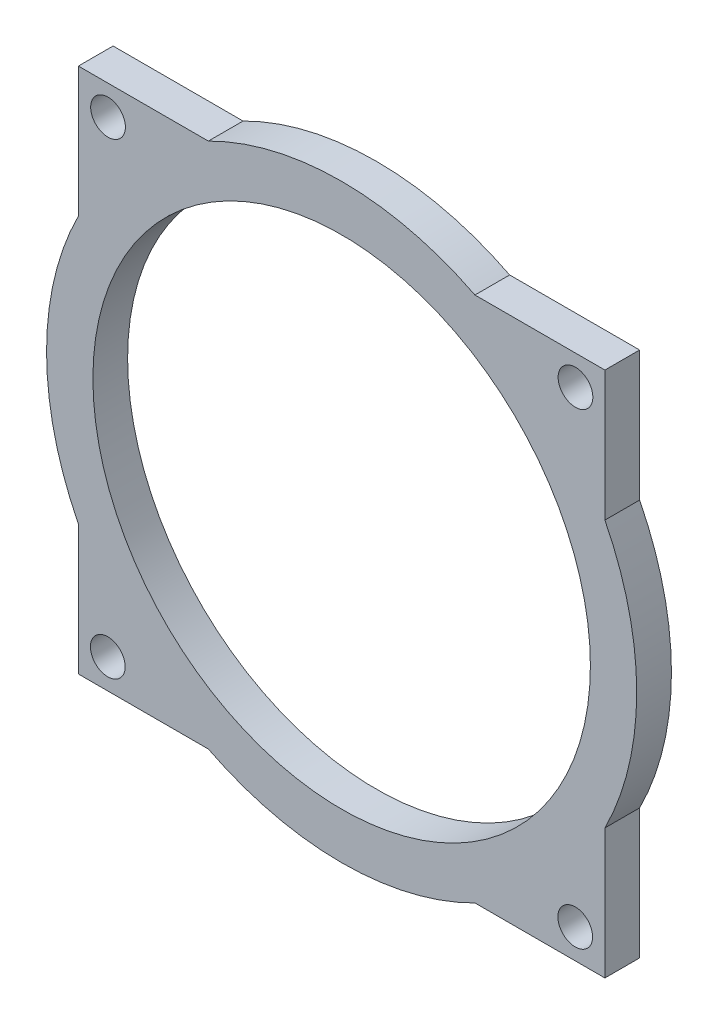
ISO-10303-21;
HEADER;
FILE_DESCRIPTION(('STEP AP214'),'2;1');
FILE_NAME('part.step','',(''),(''),'','','');
FILE_SCHEMA(('AUTOMOTIVE_DESIGN { 1 0 10303 214 1 1 1 1 }'));
ENDSEC;
DATA;
#1=APPLICATION_CONTEXT('core data for automotive mechanical design processes');
#2=APPLICATION_PROTOCOL_DEFINITION('international standard','automotive_design',2000,#1);
#3=PRODUCT_CONTEXT('',#1,'mechanical');
#4=PRODUCT('Part','Part','',(#3));
#5=PRODUCT_RELATED_PRODUCT_CATEGORY('part','',(#4));
#6=PRODUCT_DEFINITION_FORMATION('','',#4);
#7=PRODUCT_DEFINITION_CONTEXT('part definition',#1,'design');
#8=PRODUCT_DEFINITION('design','',#6,#7);
#9=PRODUCT_DEFINITION_SHAPE('','',#8);
#10=(LENGTH_UNIT() NAMED_UNIT(*) SI_UNIT(.MILLI.,.METRE.));
#11=(NAMED_UNIT(*) PLANE_ANGLE_UNIT() SI_UNIT($,.RADIAN.));
#12=(NAMED_UNIT(*) SI_UNIT($,.STERADIAN.) SOLID_ANGLE_UNIT());
#13=UNCERTAINTY_MEASURE_WITH_UNIT(LENGTH_MEASURE(1.E-05),#10,'distance_accuracy_value','');
#14=(GEOMETRIC_REPRESENTATION_CONTEXT(3) GLOBAL_UNCERTAINTY_ASSIGNED_CONTEXT((#13)) GLOBAL_UNIT_ASSIGNED_CONTEXT((#10,
#11,#12)) REPRESENTATION_CONTEXT('',''));
#15=CARTESIAN_POINT('',(0.,0.,0.));
#16=DIRECTION('',(0.,0.,1.));
#17=DIRECTION('',(1.,0.,0.));
#18=AXIS2_PLACEMENT_3D('',#15,#16,#17);
#19=CARTESIAN_POINT('',(22.75,0.,3.));
#20=DIRECTION('',(-1.,0.,0.));
#21=DIRECTION('',(0.,0.,1.));
#22=AXIS2_PLACEMENT_3D('',#19,#20,#21);
#23=PLANE('',#22);
#24=DIRECTION('',(0.,1.,0.));
#25=VECTOR('',#24,1.);
#26=CARTESIAN_POINT('',(22.75,0.,0.));
#27=LINE('',#26,#25);
#28=CARTESIAN_POINT('',(22.75,-22.7499999999994,0.));
#29=VERTEX_POINT('',#28);
#30=CARTESIAN_POINT('',(22.75,-11.5190060335083,0.));
#31=VERTEX_POINT('',#30);
#32=EDGE_CURVE('E227',#29,#31,#27,.T.);
#33=ORIENTED_EDGE('',*,*,#32,.T.);
#34=DIRECTION('',(0.,0.,-1.));
#35=VECTOR('',#34,1.);
#36=CARTESIAN_POINT('',(22.75,-11.5190060335083,3.));
#37=LINE('',#36,#35);
#38=CARTESIAN_POINT('',(22.75,-11.5190060335083,3.));
#39=VERTEX_POINT('',#38);
#40=EDGE_CURVE('E11',#39,#31,#37,.T.);
#41=ORIENTED_EDGE('',*,*,#40,.F.);
#42=DIRECTION('',(0.,1.,0.));
#43=VECTOR('',#42,1.);
#44=CARTESIAN_POINT('',(22.75,0.,3.));
#45=LINE('',#44,#43);
#46=CARTESIAN_POINT('',(22.75,-22.7499999999994,3.));
#47=VERTEX_POINT('',#46);
#48=EDGE_CURVE('E174',#47,#39,#45,.T.);
#49=ORIENTED_EDGE('',*,*,#48,.F.);
#50=DIRECTION('',(0.,0.,-1.));
#51=VECTOR('',#50,1.);
#52=CARTESIAN_POINT('',(22.75,-22.7499999999994,3.));
#53=LINE('',#52,#51);
#54=EDGE_CURVE('E49',#47,#29,#53,.T.);
#55=ORIENTED_EDGE('',*,*,#54,.T.);
#56=EDGE_LOOP('',(#33,#41,#49,#55));
#57=FACE_BOUND('',#56,.T.);
#58=ADVANCED_FACE('F32',(#57),#23,.F.);
#59=CARTESIAN_POINT('',(0.,0.,3.));
#60=DIRECTION('',(0.,0.,-1.));
#61=DIRECTION('',(-1.,0.,0.));
#62=AXIS2_PLACEMENT_3D('',#59,#60,#61);
#63=CYLINDRICAL_SURFACE('',#62,25.5);
#64=CARTESIAN_POINT('',(0.,0.,0.));
#65=DIRECTION('',(0.,0.,1.));
#66=DIRECTION('',(1.,0.,0.));
#67=AXIS2_PLACEMENT_3D('',#64,#65,#66);
#68=CIRCLE('',#67,25.5);
#69=CARTESIAN_POINT('',(22.75,11.5190060335083,0.));
#70=VERTEX_POINT('',#69);
#71=EDGE_CURVE('E223',#31,#70,#68,.T.);
#72=ORIENTED_EDGE('',*,*,#71,.T.);
#73=DIRECTION('',(0.,0.,-1.));
#74=VECTOR('',#73,1.);
#75=CARTESIAN_POINT('',(22.75,11.5190060335083,3.));
#76=LINE('',#75,#74);
#77=CARTESIAN_POINT('',(22.75,11.5190060335083,3.));
#78=VERTEX_POINT('',#77);
#79=EDGE_CURVE('E41',#78,#70,#76,.T.);
#80=ORIENTED_EDGE('',*,*,#79,.F.);
#81=CARTESIAN_POINT('',(0.,0.,3.));
#82=DIRECTION('',(0.,0.,1.));
#83=DIRECTION('',(1.,0.,0.));
#84=AXIS2_PLACEMENT_3D('',#81,#82,#83);
#85=CIRCLE('',#84,25.5);
#86=EDGE_CURVE('E100',#39,#78,#85,.T.);
#87=ORIENTED_EDGE('',*,*,#86,.F.);
#88=ORIENTED_EDGE('',*,*,#40,.T.);
#89=EDGE_LOOP('',(#72,#80,#87,#88));
#90=FACE_BOUND('',#89,.T.);
#91=ADVANCED_FACE('F224',(#90),#63,.T.);
#92=CARTESIAN_POINT('',(22.750000000001,1.87644016289042E-12,3.));
#93=DIRECTION('',(1.,0.,0.));
#94=DIRECTION('',(0.,1.,0.));
#95=AXIS2_PLACEMENT_3D('',#92,#93,#94);
#96=PLANE('',#95);
#97=DIRECTION('',(0.,-1.,0.));
#98=VECTOR('',#97,1.);
#99=CARTESIAN_POINT('',(22.750000000001,1.87644016289042E-12,0.));
#100=LINE('',#99,#98);
#101=CARTESIAN_POINT('',(22.7499999999991,22.75,0.));
#102=VERTEX_POINT('',#101);
#103=EDGE_CURVE('E221',#102,#70,#100,.T.);
#104=ORIENTED_EDGE('',*,*,#103,.F.);
#105=DIRECTION('',(0.,0.,-1.));
#106=VECTOR('',#105,1.);
#107=CARTESIAN_POINT('',(22.7499999999991,22.75,3.));
#108=LINE('',#107,#106);
#109=CARTESIAN_POINT('',(22.7499999999991,22.75,3.));
#110=VERTEX_POINT('',#109);
#111=EDGE_CURVE('E215',#110,#102,#108,.T.);
#112=ORIENTED_EDGE('',*,*,#111,.F.);
#113=DIRECTION('',(0.,-1.,0.));
#114=VECTOR('',#113,1.);
#115=CARTESIAN_POINT('',(22.750000000001,1.87644016289042E-12,3.));
#116=LINE('',#115,#114);
#117=EDGE_CURVE('E170',#110,#78,#116,.T.);
#118=ORIENTED_EDGE('',*,*,#117,.T.);
#119=ORIENTED_EDGE('',*,*,#79,.T.);
#120=EDGE_LOOP('',(#104,#112,#118,#119));
#121=FACE_BOUND('',#120,.T.);
#122=ADVANCED_FACE('F219',(#121),#96,.T.);
#123=CARTESIAN_POINT('',(0.,22.75,3.));
#124=DIRECTION('',(0.,-1.,0.));
#125=DIRECTION('',(0.,0.,-1.));
#126=AXIS2_PLACEMENT_3D('',#123,#124,#125);
#127=PLANE('',#126);
#128=DIRECTION('',(-1.,0.,0.));
#129=VECTOR('',#128,1.);
#130=CARTESIAN_POINT('',(0.,22.75,0.));
#131=LINE('',#130,#129);
#132=CARTESIAN_POINT('',(11.5190060335083,22.75,0.));
#133=VERTEX_POINT('',#132);
#134=EDGE_CURVE('E232',#102,#133,#131,.T.);
#135=ORIENTED_EDGE('',*,*,#134,.T.);
#136=DIRECTION('',(0.,0.,-1.));
#137=VECTOR('',#136,1.);
#138=CARTESIAN_POINT('',(11.5190060335083,22.75,3.));
#139=LINE('',#138,#137);
#140=CARTESIAN_POINT('',(11.5190060335083,22.75,3.));
#141=VERTEX_POINT('',#140);
#142=EDGE_CURVE('E212',#141,#133,#139,.T.);
#143=ORIENTED_EDGE('',*,*,#142,.F.);
#144=DIRECTION('',(-1.,0.,0.));
#145=VECTOR('',#144,1.);
#146=CARTESIAN_POINT('',(0.,22.75,3.));
#147=LINE('',#146,#145);
#148=EDGE_CURVE('E168',#110,#141,#147,.T.);
#149=ORIENTED_EDGE('',*,*,#148,.F.);
#150=ORIENTED_EDGE('',*,*,#111,.T.);
#151=EDGE_LOOP('',(#135,#143,#149,#150));
#152=FACE_BOUND('',#151,.T.);
#153=ADVANCED_FACE('F303',(#152),#127,.F.);
#154=CARTESIAN_POINT('',(0.,0.,3.));
#155=DIRECTION('',(0.,0.,-1.));
#156=DIRECTION('',(-1.,0.,0.));
#157=AXIS2_PLACEMENT_3D('',#154,#155,#156);
#158=CYLINDRICAL_SURFACE('',#157,25.5);
#159=CARTESIAN_POINT('',(0.,0.,0.));
#160=DIRECTION('',(0.,0.,1.));
#161=DIRECTION('',(1.,0.,0.));
#162=AXIS2_PLACEMENT_3D('',#159,#160,#161);
#163=CIRCLE('',#162,25.5);
#164=CARTESIAN_POINT('',(-11.5190060335082,22.75,0.));
#165=VERTEX_POINT('',#164);
#166=EDGE_CURVE('E234',#133,#165,#163,.T.);
#167=ORIENTED_EDGE('',*,*,#166,.T.);
#168=DIRECTION('',(0.,0.,-1.));
#169=VECTOR('',#168,1.);
#170=CARTESIAN_POINT('',(-11.5190060335082,22.75,3.));
#171=LINE('',#170,#169);
#172=CARTESIAN_POINT('',(-11.5190060335082,22.75,3.));
#173=VERTEX_POINT('',#172);
#174=EDGE_CURVE('E210',#173,#165,#171,.T.);
#175=ORIENTED_EDGE('',*,*,#174,.F.);
#176=CARTESIAN_POINT('',(0.,0.,3.));
#177=DIRECTION('',(0.,0.,1.));
#178=DIRECTION('',(1.,0.,0.));
#179=AXIS2_PLACEMENT_3D('',#176,#177,#178);
#180=CIRCLE('',#179,25.5);
#181=EDGE_CURVE('E164',#141,#173,#180,.T.);
#182=ORIENTED_EDGE('',*,*,#181,.F.);
#183=ORIENTED_EDGE('',*,*,#142,.T.);
#184=EDGE_LOOP('',(#167,#175,#182,#183));
#185=FACE_BOUND('',#184,.T.);
#186=ADVANCED_FACE('F305',(#185),#158,.T.);
#187=CARTESIAN_POINT('',(0.,22.75,3.));
#188=DIRECTION('',(0.,1.,0.));
#189=DIRECTION('',(0.,0.,1.));
#190=AXIS2_PLACEMENT_3D('',#187,#188,#189);
#191=PLANE('',#190);
#192=DIRECTION('',(1.,0.,0.));
#193=VECTOR('',#192,1.);
#194=CARTESIAN_POINT('',(0.,22.75,0.));
#195=LINE('',#194,#193);
#196=CARTESIAN_POINT('',(-22.7500000000002,22.75,0.));
#197=VERTEX_POINT('',#196);
#198=EDGE_CURVE('E240',#197,#165,#195,.T.);
#199=ORIENTED_EDGE('',*,*,#198,.F.);
#200=DIRECTION('',(0.,0.,-1.));
#201=VECTOR('',#200,1.);
#202=CARTESIAN_POINT('',(-22.7500000000002,22.75,3.));
#203=LINE('',#202,#201);
#204=CARTESIAN_POINT('',(-22.7500000000002,22.75,3.));
#205=VERTEX_POINT('',#204);
#206=EDGE_CURVE('E208',#205,#197,#203,.T.);
#207=ORIENTED_EDGE('',*,*,#206,.F.);
#208=DIRECTION('',(1.,0.,0.));
#209=VECTOR('',#208,1.);
#210=CARTESIAN_POINT('',(0.,22.75,3.));
#211=LINE('',#210,#209);
#212=EDGE_CURVE('E159',#205,#173,#211,.T.);
#213=ORIENTED_EDGE('',*,*,#212,.T.);
#214=ORIENTED_EDGE('',*,*,#174,.T.);
#215=EDGE_LOOP('',(#199,#207,#213,#214));
#216=FACE_BOUND('',#215,.T.);
#217=ADVANCED_FACE('F308',(#216),#191,.T.);
#218=CARTESIAN_POINT('',(-22.7500000000002,0.,3.));
#219=DIRECTION('',(1.,0.,0.));
#220=DIRECTION('',(0.,0.,-1.));
#221=AXIS2_PLACEMENT_3D('',#218,#219,#220);
#222=PLANE('',#221);
#223=DIRECTION('',(0.,-1.,0.));
#224=VECTOR('',#223,1.);
#225=CARTESIAN_POINT('',(-22.7500000000002,0.,0.));
#226=LINE('',#225,#224);
#227=CARTESIAN_POINT('',(-22.7500000000002,11.5190060335083,0.));
#228=VERTEX_POINT('',#227);
#229=EDGE_CURVE('E243',#197,#228,#226,.T.);
#230=ORIENTED_EDGE('',*,*,#229,.T.);
#231=DIRECTION('',(0.,0.,-1.));
#232=VECTOR('',#231,1.);
#233=CARTESIAN_POINT('',(-22.7500000000002,11.5190060335083,3.));
#234=LINE('',#233,#232);
#235=CARTESIAN_POINT('',(-22.7500000000002,11.5190060335083,3.));
#236=VERTEX_POINT('',#235);
#237=EDGE_CURVE('E205',#236,#228,#234,.T.);
#238=ORIENTED_EDGE('',*,*,#237,.F.);
#239=DIRECTION('',(0.,-1.,0.));
#240=VECTOR('',#239,1.);
#241=CARTESIAN_POINT('',(-22.7500000000002,0.,3.));
#242=LINE('',#241,#240);
#243=EDGE_CURVE('E156',#205,#236,#242,.T.);
#244=ORIENTED_EDGE('',*,*,#243,.F.);
#245=ORIENTED_EDGE('',*,*,#206,.T.);
#246=EDGE_LOOP('',(#230,#238,#244,#245));
#247=FACE_BOUND('',#246,.T.);
#248=ADVANCED_FACE('F311',(#247),#222,.F.);
#249=CARTESIAN_POINT('',(0.,0.,3.));
#250=DIRECTION('',(0.,0.,-1.));
#251=DIRECTION('',(-1.,0.,0.));
#252=AXIS2_PLACEMENT_3D('',#249,#250,#251);
#253=CYLINDRICAL_SURFACE('',#252,25.5000000000001);
#254=CARTESIAN_POINT('',(0.,0.,0.));
#255=DIRECTION('',(0.,0.,1.));
#256=DIRECTION('',(1.,0.,0.));
#257=AXIS2_PLACEMENT_3D('',#254,#255,#256);
#258=CIRCLE('',#257,25.5000000000001);
#259=CARTESIAN_POINT('',(-22.75,-11.5190060335083,0.));
#260=VERTEX_POINT('',#259);
#261=EDGE_CURVE('E245',#228,#260,#258,.T.);
#262=ORIENTED_EDGE('',*,*,#261,.T.);
#263=DIRECTION('',(0.,0.,-1.));
#264=VECTOR('',#263,1.);
#265=CARTESIAN_POINT('',(-22.75,-11.5190060335083,3.));
#266=LINE('',#265,#264);
#267=CARTESIAN_POINT('',(-22.75,-11.5190060335083,3.));
#268=VERTEX_POINT('',#267);
#269=EDGE_CURVE('E203',#268,#260,#266,.T.);
#270=ORIENTED_EDGE('',*,*,#269,.F.);
#271=CARTESIAN_POINT('',(0.,0.,3.));
#272=DIRECTION('',(0.,0.,1.));
#273=DIRECTION('',(1.,0.,0.));
#274=AXIS2_PLACEMENT_3D('',#271,#272,#273);
#275=CIRCLE('',#274,25.5000000000001);
#276=EDGE_CURVE('E151',#236,#268,#275,.T.);
#277=ORIENTED_EDGE('',*,*,#276,.F.);
#278=ORIENTED_EDGE('',*,*,#237,.T.);
#279=EDGE_LOOP('',(#262,#270,#277,#278));
#280=FACE_BOUND('',#279,.T.);
#281=ADVANCED_FACE('F262',(#280),#253,.T.);
#282=CARTESIAN_POINT('',(-22.750000000001,-1.89049589444766E-12,3.));
#283=DIRECTION('',(-1.,0.,0.));
#284=DIRECTION('',(0.,-1.,0.));
#285=AXIS2_PLACEMENT_3D('',#282,#283,#284);
#286=PLANE('',#285);
#287=DIRECTION('',(0.,1.,0.));
#288=VECTOR('',#287,1.);
#289=CARTESIAN_POINT('',(-22.750000000001,-1.89049589444766E-12,0.));
#290=LINE('',#289,#288);
#291=CARTESIAN_POINT('',(-22.7499999999991,-22.75,0.));
#292=VERTEX_POINT('',#291);
#293=EDGE_CURVE('E248',#292,#260,#290,.T.);
#294=ORIENTED_EDGE('',*,*,#293,.F.);
#295=DIRECTION('',(0.,0.,-1.));
#296=VECTOR('',#295,1.);
#297=CARTESIAN_POINT('',(-22.7499999999991,-22.75,3.));
#298=LINE('',#297,#296);
#299=CARTESIAN_POINT('',(-22.7499999999991,-22.75,3.));
#300=VERTEX_POINT('',#299);
#301=EDGE_CURVE('E146',#300,#292,#298,.T.);
#302=ORIENTED_EDGE('',*,*,#301,.F.);
#303=DIRECTION('',(0.,1.,0.));
#304=VECTOR('',#303,1.);
#305=CARTESIAN_POINT('',(-22.750000000001,-1.89049589444766E-12,3.));
#306=LINE('',#305,#304);
#307=EDGE_CURVE('E136',#300,#268,#306,.T.);
#308=ORIENTED_EDGE('',*,*,#307,.T.);
#309=ORIENTED_EDGE('',*,*,#269,.T.);
#310=EDGE_LOOP('',(#294,#302,#308,#309));
#311=FACE_BOUND('',#310,.T.);
#312=ADVANCED_FACE('F316',(#311),#286,.T.);
#313=CARTESIAN_POINT('',(0.,-22.75,3.));
#314=DIRECTION('',(0.,1.,0.));
#315=DIRECTION('',(0.,0.,1.));
#316=AXIS2_PLACEMENT_3D('',#313,#314,#315);
#317=PLANE('',#316);
#318=DIRECTION('',(1.,0.,0.));
#319=VECTOR('',#318,1.);
#320=CARTESIAN_POINT('',(0.,-22.75,0.));
#321=LINE('',#320,#319);
#322=CARTESIAN_POINT('',(-11.5190060335083,-22.75,0.));
#323=VERTEX_POINT('',#322);
#324=EDGE_CURVE('E143',#292,#323,#321,.T.);
#325=ORIENTED_EDGE('',*,*,#324,.T.);
#326=DIRECTION('',(0.,0.,-1.));
#327=VECTOR('',#326,1.);
#328=CARTESIAN_POINT('',(-11.5190060335083,-22.75,3.));
#329=LINE('',#328,#327);
#330=CARTESIAN_POINT('',(-11.5190060335083,-22.75,3.));
#331=VERTEX_POINT('',#330);
#332=EDGE_CURVE('E140',#331,#323,#329,.T.);
#333=ORIENTED_EDGE('',*,*,#332,.F.);
#334=DIRECTION('',(1.,0.,0.));
#335=VECTOR('',#334,1.);
#336=CARTESIAN_POINT('',(0.,-22.75,3.));
#337=LINE('',#336,#335);
#338=EDGE_CURVE('E128',#300,#331,#337,.T.);
#339=ORIENTED_EDGE('',*,*,#338,.F.);
#340=ORIENTED_EDGE('',*,*,#301,.T.);
#341=EDGE_LOOP('',(#325,#333,#339,#340));
#342=FACE_BOUND('',#341,.T.);
#343=ADVANCED_FACE('F141',(#342),#317,.F.);
#344=CARTESIAN_POINT('',(11.5190060335083,-22.75,0.));
#345=VERTEX_POINT('',#344);
#346=EDGE_CURVE('E196',#323,#345,#258,.T.);
#347=ORIENTED_EDGE('',*,*,#346,.T.);
#348=DIRECTION('',(0.,0.,-1.));
#349=VECTOR('',#348,1.);
#350=CARTESIAN_POINT('',(11.5190060335083,-22.75,3.));
#351=LINE('',#350,#349);
#352=CARTESIAN_POINT('',(11.5190060335083,-22.75,3.));
#353=VERTEX_POINT('',#352);
#354=EDGE_CURVE('E88',#353,#345,#351,.T.);
#355=ORIENTED_EDGE('',*,*,#354,.F.);
#356=EDGE_CURVE('E134',#331,#353,#275,.T.);
#357=ORIENTED_EDGE('',*,*,#356,.F.);
#358=ORIENTED_EDGE('',*,*,#332,.T.);
#359=EDGE_LOOP('',(#347,#355,#357,#358));
#360=FACE_BOUND('',#359,.T.);
#361=ADVANCED_FACE('F148',(#360),#253,.T.);
#362=CARTESIAN_POINT('',(1.2509601085936E-12,-22.7500000000006,3.));
#363=DIRECTION('',(0.,-1.,0.));
#364=DIRECTION('',(1.,0.,0.));
#365=AXIS2_PLACEMENT_3D('',#362,#363,#364);
#366=PLANE('',#365);
#367=DIRECTION('',(-1.,0.,0.));
#368=VECTOR('',#367,1.);
#369=CARTESIAN_POINT('',(1.2509601085936E-12,-22.7500000000006,0.));
#370=LINE('',#369,#368);
#371=EDGE_CURVE('E191',#29,#345,#370,.T.);
#372=ORIENTED_EDGE('',*,*,#371,.F.);
#373=ORIENTED_EDGE('',*,*,#54,.F.);
#374=DIRECTION('',(-1.,0.,0.));
#375=VECTOR('',#374,1.);
#376=CARTESIAN_POINT('',(1.2509601085936E-12,-22.7500000000006,3.));
#377=LINE('',#376,#375);
#378=EDGE_CURVE('E149',#47,#353,#377,.T.);
#379=ORIENTED_EDGE('',*,*,#378,.T.);
#380=ORIENTED_EDGE('',*,*,#354,.T.);
#381=EDGE_LOOP('',(#372,#373,#379,#380));
#382=FACE_BOUND('',#381,.T.);
#383=ADVANCED_FACE('F250',(#382),#366,.T.);
#384=CARTESIAN_POINT('',(0.,0.,3.));
#385=DIRECTION('',(0.,0.,-1.));
#386=DIRECTION('',(-1.,0.,0.));
#387=AXIS2_PLACEMENT_3D('',#384,#385,#386);
#388=CYLINDRICAL_SURFACE('',#387,21.4961508601219);
#389=CARTESIAN_POINT('',(0.,0.,3.));
#390=DIRECTION('',(0.,0.,1.));
#391=DIRECTION('',(1.,0.,0.));
#392=AXIS2_PLACEMENT_3D('',#389,#390,#391);
#393=CIRCLE('',#392,21.4961508601219);
#394=CARTESIAN_POINT('',(21.4961508601219,0.,3.));
#395=VERTEX_POINT('',#394);
#396=EDGE_CURVE('E176',#395,#395,#393,.T.);
#397=ORIENTED_EDGE('',*,*,#396,.T.);
#398=EDGE_LOOP('',(#397));
#399=FACE_BOUND('',#398,.T.);
#400=CARTESIAN_POINT('',(0.,0.,0.));
#401=DIRECTION('',(0.,0.,1.));
#402=DIRECTION('',(1.,0.,0.));
#403=AXIS2_PLACEMENT_3D('',#400,#401,#402);
#404=CIRCLE('',#403,21.4961508601219);
#405=CARTESIAN_POINT('',(21.4961508601219,0.,0.));
#406=VERTEX_POINT('',#405);
#407=EDGE_CURVE('E291',#406,#406,#404,.T.);
#408=ORIENTED_EDGE('',*,*,#407,.F.);
#409=EDGE_LOOP('',(#408));
#410=FACE_BOUND('',#409,.T.);
#411=ADVANCED_FACE('F252',(#399,#410),#388,.F.);
#412=CARTESIAN_POINT('',(20.1888175747202,-20.2073893707747,3.));
#413=DIRECTION('',(0.,0.,-1.));
#414=DIRECTION('',(-1.,0.,0.));
#415=AXIS2_PLACEMENT_3D('',#412,#413,#414);
#416=CYLINDRICAL_SURFACE('',#415,1.5);
#417=CARTESIAN_POINT('',(20.1888175747202,-20.2073893707747,3.));
#418=DIRECTION('',(0.,0.,1.));
#419=DIRECTION('',(1.,0.,0.));
#420=AXIS2_PLACEMENT_3D('',#417,#418,#419);
#421=CIRCLE('',#420,1.5);
#422=CARTESIAN_POINT('',(21.6888175747202,-20.2073893707747,3.));
#423=VERTEX_POINT('',#422);
#424=EDGE_CURVE('E179',#423,#423,#421,.T.);
#425=ORIENTED_EDGE('',*,*,#424,.T.);
#426=EDGE_LOOP('',(#425));
#427=FACE_BOUND('',#426,.T.);
#428=CARTESIAN_POINT('',(20.1888175747202,-20.2073893707747,0.));
#429=DIRECTION('',(0.,0.,1.));
#430=DIRECTION('',(1.,0.,0.));
#431=AXIS2_PLACEMENT_3D('',#428,#429,#430);
#432=CIRCLE('',#431,1.5);
#433=CARTESIAN_POINT('',(21.6888175747202,-20.2073893707747,0.));
#434=VERTEX_POINT('',#433);
#435=EDGE_CURVE('E287',#434,#434,#432,.T.);
#436=ORIENTED_EDGE('',*,*,#435,.F.);
#437=EDGE_LOOP('',(#436));
#438=FACE_BOUND('',#437,.T.);
#439=ADVANCED_FACE('F258',(#427,#438),#416,.F.);
#440=CARTESIAN_POINT('',(-20.18881757472,20.2073893707748,3.));
#441=DIRECTION('',(0.,0.,-1.));
#442=DIRECTION('',(-1.,0.,0.));
#443=AXIS2_PLACEMENT_3D('',#440,#441,#442);
#444=CYLINDRICAL_SURFACE('',#443,1.5);
#445=CARTESIAN_POINT('',(-20.18881757472,20.2073893707748,3.));
#446=DIRECTION('',(0.,0.,1.));
#447=DIRECTION('',(1.,0.,0.));
#448=AXIS2_PLACEMENT_3D('',#445,#446,#447);
#449=CIRCLE('',#448,1.5);
#450=CARTESIAN_POINT('',(-18.68881757472,20.2073893707748,3.));
#451=VERTEX_POINT('',#450);
#452=EDGE_CURVE('E182',#451,#451,#449,.T.);
#453=ORIENTED_EDGE('',*,*,#452,.T.);
#454=EDGE_LOOP('',(#453));
#455=FACE_BOUND('',#454,.T.);
#456=CARTESIAN_POINT('',(-20.18881757472,20.2073893707748,0.));
#457=DIRECTION('',(0.,0.,1.));
#458=DIRECTION('',(1.,0.,0.));
#459=AXIS2_PLACEMENT_3D('',#456,#457,#458);
#460=CIRCLE('',#459,1.5);
#461=CARTESIAN_POINT('',(-18.68881757472,20.2073893707748,0.));
#462=VERTEX_POINT('',#461);
#463=EDGE_CURVE('E285',#462,#462,#460,.T.);
#464=ORIENTED_EDGE('',*,*,#463,.F.);
#465=EDGE_LOOP('',(#464));
#466=FACE_BOUND('',#465,.T.);
#467=ADVANCED_FACE('F273',(#455,#466),#444,.F.);
#468=CARTESIAN_POINT('',(20.2073893707749,20.18881757472,3.));
#469=DIRECTION('',(0.,0.,-1.));
#470=DIRECTION('',(-1.,0.,0.));
#471=AXIS2_PLACEMENT_3D('',#468,#469,#470);
#472=CYLINDRICAL_SURFACE('',#471,1.5);
#473=CARTESIAN_POINT('',(20.2073893707749,20.18881757472,3.));
#474=DIRECTION('',(0.,0.,1.));
#475=DIRECTION('',(1.,0.,0.));
#476=AXIS2_PLACEMENT_3D('',#473,#474,#475);
#477=CIRCLE('',#476,1.5);
#478=CARTESIAN_POINT('',(21.7073893707749,20.18881757472,3.));
#479=VERTEX_POINT('',#478);
#480=EDGE_CURVE('E185',#479,#479,#477,.T.);
#481=ORIENTED_EDGE('',*,*,#480,.T.);
#482=EDGE_LOOP('',(#481));
#483=FACE_BOUND('',#482,.T.);
#484=CARTESIAN_POINT('',(20.2073893707749,20.18881757472,0.));
#485=DIRECTION('',(0.,0.,1.));
#486=DIRECTION('',(1.,0.,0.));
#487=AXIS2_PLACEMENT_3D('',#484,#485,#486);
#488=CIRCLE('',#487,1.5);
#489=CARTESIAN_POINT('',(21.7073893707749,20.18881757472,0.));
#490=VERTEX_POINT('',#489);
#491=EDGE_CURVE('E288',#490,#490,#488,.T.);
#492=ORIENTED_EDGE('',*,*,#491,.F.);
#493=EDGE_LOOP('',(#492));
#494=FACE_BOUND('',#493,.T.);
#495=ADVANCED_FACE('F34',(#483,#494),#472,.F.);
#496=CARTESIAN_POINT('',(-20.2073893707747,-20.1888175747201,3.));
#497=DIRECTION('',(0.,0.,-1.));
#498=DIRECTION('',(-1.,0.,0.));
#499=AXIS2_PLACEMENT_3D('',#496,#497,#498);
#500=CYLINDRICAL_SURFACE('',#499,1.5);
#501=CARTESIAN_POINT('',(-20.2073893707747,-20.1888175747201,3.));
#502=DIRECTION('',(0.,0.,1.));
#503=DIRECTION('',(1.,0.,0.));
#504=AXIS2_PLACEMENT_3D('',#501,#502,#503);
#505=CIRCLE('',#504,1.5);
#506=CARTESIAN_POINT('',(-18.7073893707748,-20.1888175747201,3.));
#507=VERTEX_POINT('',#506);
#508=EDGE_CURVE('E152',#507,#507,#505,.T.);
#509=ORIENTED_EDGE('',*,*,#508,.T.);
#510=EDGE_LOOP('',(#509));
#511=FACE_BOUND('',#510,.T.);
#512=CARTESIAN_POINT('',(-20.2073893707747,-20.1888175747201,0.));
#513=DIRECTION('',(0.,0.,1.));
#514=DIRECTION('',(1.,0.,0.));
#515=AXIS2_PLACEMENT_3D('',#512,#513,#514);
#516=CIRCLE('',#515,1.5);
#517=CARTESIAN_POINT('',(-18.7073893707748,-20.1888175747201,0.));
#518=VERTEX_POINT('',#517);
#519=EDGE_CURVE('E187',#518,#518,#516,.T.);
#520=ORIENTED_EDGE('',*,*,#519,.F.);
#521=EDGE_LOOP('',(#520));
#522=FACE_BOUND('',#521,.T.);
#523=ADVANCED_FACE('F280',(#511,#522),#500,.F.);
#524=CARTESIAN_POINT('',(0.,0.,3.));
#525=DIRECTION('',(0.,0.,1.));
#526=DIRECTION('',(1.,0.,0.));
#527=AXIS2_PLACEMENT_3D('',#524,#525,#526);
#528=PLANE('',#527);
#529=ORIENTED_EDGE('',*,*,#480,.F.);
#530=EDGE_LOOP('',(#529));
#531=FACE_BOUND('',#530,.T.);
#532=ORIENTED_EDGE('',*,*,#452,.F.);
#533=EDGE_LOOP('',(#532));
#534=FACE_BOUND('',#533,.T.);
#535=ORIENTED_EDGE('',*,*,#424,.F.);
#536=EDGE_LOOP('',(#535));
#537=FACE_BOUND('',#536,.T.);
#538=ORIENTED_EDGE('',*,*,#396,.F.);
#539=EDGE_LOOP('',(#538));
#540=FACE_BOUND('',#539,.T.);
#541=ORIENTED_EDGE('',*,*,#48,.T.);
#542=ORIENTED_EDGE('',*,*,#86,.T.);
#543=ORIENTED_EDGE('',*,*,#117,.F.);
#544=ORIENTED_EDGE('',*,*,#148,.T.);
#545=ORIENTED_EDGE('',*,*,#181,.T.);
#546=ORIENTED_EDGE('',*,*,#212,.F.);
#547=ORIENTED_EDGE('',*,*,#243,.T.);
#548=ORIENTED_EDGE('',*,*,#276,.T.);
#549=ORIENTED_EDGE('',*,*,#307,.F.);
#550=ORIENTED_EDGE('',*,*,#338,.T.);
#551=ORIENTED_EDGE('',*,*,#356,.T.);
#552=ORIENTED_EDGE('',*,*,#378,.F.);
#553=EDGE_LOOP('',(#541,#542,#543,#544,#545,#546,#547,#548,#549,#550,#551,#552));
#554=FACE_BOUND('',#553,.T.);
#555=ORIENTED_EDGE('',*,*,#508,.F.);
#556=EDGE_LOOP('',(#555));
#557=FACE_BOUND('',#556,.T.);
#558=ADVANCED_FACE('F130',(#531,#534,#537,#540,#554,#557),#528,.T.);
#559=CARTESIAN_POINT('',(0.,0.,0.));
#560=DIRECTION('',(0.,0.,1.));
#561=DIRECTION('',(1.,0.,0.));
#562=AXIS2_PLACEMENT_3D('',#559,#560,#561);
#563=PLANE('',#562);
#564=ORIENTED_EDGE('',*,*,#491,.T.);
#565=EDGE_LOOP('',(#564));
#566=FACE_BOUND('',#565,.T.);
#567=ORIENTED_EDGE('',*,*,#463,.T.);
#568=EDGE_LOOP('',(#567));
#569=FACE_BOUND('',#568,.T.);
#570=ORIENTED_EDGE('',*,*,#435,.T.);
#571=EDGE_LOOP('',(#570));
#572=FACE_BOUND('',#571,.T.);
#573=ORIENTED_EDGE('',*,*,#407,.T.);
#574=EDGE_LOOP('',(#573));
#575=FACE_BOUND('',#574,.T.);
#576=ORIENTED_EDGE('',*,*,#32,.F.);
#577=ORIENTED_EDGE('',*,*,#371,.T.);
#578=ORIENTED_EDGE('',*,*,#346,.F.);
#579=ORIENTED_EDGE('',*,*,#324,.F.);
#580=ORIENTED_EDGE('',*,*,#293,.T.);
#581=ORIENTED_EDGE('',*,*,#261,.F.);
#582=ORIENTED_EDGE('',*,*,#229,.F.);
#583=ORIENTED_EDGE('',*,*,#198,.T.);
#584=ORIENTED_EDGE('',*,*,#166,.F.);
#585=ORIENTED_EDGE('',*,*,#134,.F.);
#586=ORIENTED_EDGE('',*,*,#103,.T.);
#587=ORIENTED_EDGE('',*,*,#71,.F.);
#588=EDGE_LOOP('',(#576,#577,#578,#579,#580,#581,#582,#583,#584,#585,#586,#587));
#589=FACE_BOUND('',#588,.T.);
#590=ORIENTED_EDGE('',*,*,#519,.T.);
#591=EDGE_LOOP('',(#590));
#592=FACE_BOUND('',#591,.T.);
#593=ADVANCED_FACE('F230',(#566,#569,#572,#575,#589,#592),#563,.F.);
#594=CLOSED_SHELL('',(#58,#91,#122,#153,#186,#217,#248,#281,#312,#343,#361,#383,#411,#439,#467,
#495,#523,#558,#593));
#595=MANIFOLD_SOLID_BREP('B2',#594);
#596=ADVANCED_BREP_SHAPE_REPRESENTATION('',(#18,#595),#14);
#597=SHAPE_DEFINITION_REPRESENTATION(#9,#596);
ENDSEC;
END-ISO-10303-21;
